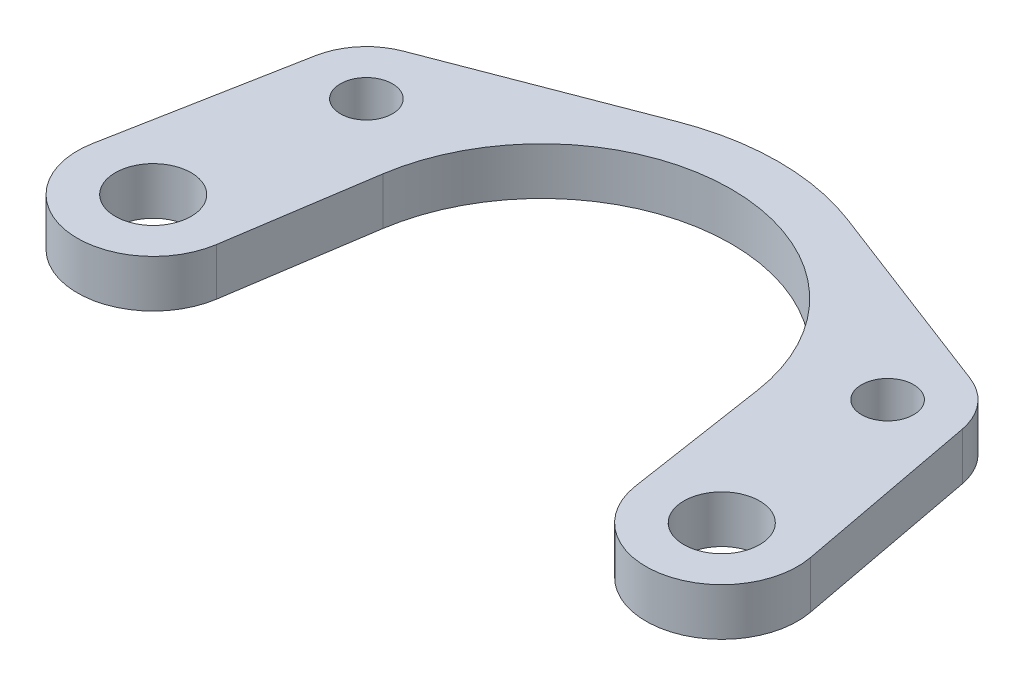
ISO-10303-21;
HEADER;
FILE_DESCRIPTION(('STEP AP214'),'2;1');
FILE_NAME('part.step','',(''),(''),'','','');
FILE_SCHEMA(('AUTOMOTIVE_DESIGN { 1 0 10303 214 1 1 1 1 }'));
ENDSEC;
DATA;
#1=APPLICATION_CONTEXT('core data for automotive mechanical design processes');
#2=APPLICATION_PROTOCOL_DEFINITION('international standard','automotive_design',2000,#1);
#3=PRODUCT_CONTEXT('',#1,'mechanical');
#4=PRODUCT('Part','Part','',(#3));
#5=PRODUCT_RELATED_PRODUCT_CATEGORY('part','',(#4));
#6=PRODUCT_DEFINITION_FORMATION('','',#4);
#7=PRODUCT_DEFINITION_CONTEXT('part definition',#1,'design');
#8=PRODUCT_DEFINITION('design','',#6,#7);
#9=PRODUCT_DEFINITION_SHAPE('','',#8);
#10=(LENGTH_UNIT() NAMED_UNIT(*) SI_UNIT(.MILLI.,.METRE.));
#11=(NAMED_UNIT(*) PLANE_ANGLE_UNIT() SI_UNIT($,.RADIAN.));
#12=(NAMED_UNIT(*) SI_UNIT($,.STERADIAN.) SOLID_ANGLE_UNIT());
#13=UNCERTAINTY_MEASURE_WITH_UNIT(LENGTH_MEASURE(1.E-05),#10,'distance_accuracy_value','');
#14=(GEOMETRIC_REPRESENTATION_CONTEXT(3) GLOBAL_UNCERTAINTY_ASSIGNED_CONTEXT((#13)) GLOBAL_UNIT_ASSIGNED_CONTEXT((#10,
#11,#12)) REPRESENTATION_CONTEXT('',''));
#15=CARTESIAN_POINT('',(0.,0.,0.));
#16=DIRECTION('',(0.,0.,1.));
#17=DIRECTION('',(1.,0.,0.));
#18=AXIS2_PLACEMENT_3D('',#15,#16,#17);
#19=CARTESIAN_POINT('',(38.1,6.35,13.97));
#20=DIRECTION('',(0.,1.,0.));
#21=DIRECTION('',(0.,0.,1.));
#22=AXIS2_PLACEMENT_3D('',#19,#20,#21);
#23=PLANE('',#22);
#24=CARTESIAN_POINT('',(-34.925,6.35,-11.43));
#25=DIRECTION('',(0.,1.,0.));
#26=DIRECTION('',(0.,0.,-1.));
#27=AXIS2_PLACEMENT_3D('',#24,#25,#26);
#28=CIRCLE('',#27,3.49250000000001);
#29=CARTESIAN_POINT('',(-34.925,6.35,-14.9225));
#30=VERTEX_POINT('',#29);
#31=EDGE_CURVE('E290',#30,#30,#28,.T.);
#32=ORIENTED_EDGE('',*,*,#31,.F.);
#33=EDGE_LOOP('',(#32));
#34=FACE_BOUND('',#33,.T.);
#35=CARTESIAN_POINT('',(38.1,6.35,13.97));
#36=DIRECTION('',(0.,1.,0.));
#37=DIRECTION('',(0.,0.,1.));
#38=AXIS2_PLACEMENT_3D('',#35,#36,#37);
#39=CIRCLE('',#38,5.08000000000001);
#40=CARTESIAN_POINT('',(38.1,6.35,19.05));
#41=VERTEX_POINT('',#40);
#42=EDGE_CURVE('E157',#41,#41,#39,.T.);
#43=ORIENTED_EDGE('',*,*,#42,.F.);
#44=EDGE_LOOP('',(#43));
#45=FACE_BOUND('',#44,.T.);
#46=CARTESIAN_POINT('',(38.1,6.35,13.97));
#47=DIRECTION('',(0.,1.,0.));
#48=DIRECTION('',(0.,0.,1.));
#49=AXIS2_PLACEMENT_3D('',#46,#47,#48);
#50=CIRCLE('',#49,10.16);
#51=CARTESIAN_POINT('',(28.0560006556144,6.35,15.5009073028699));
#52=VERTEX_POINT('',#51);
#53=CARTESIAN_POINT('',(48.0839831202843,6.35,12.0870021099644));
#54=VERTEX_POINT('',#53);
#55=EDGE_CURVE('E176',#52,#54,#50,.T.);
#56=ORIENTED_EDGE('',*,*,#55,.T.);
#57=DIRECTION('',(-0.185334437995624,0.,-0.982675503964989));
#58=VECTOR('',#57,1.);
#59=CARTESIAN_POINT('',(48.0839831202843,6.35,12.0870021099644));
#60=LINE('',#59,#58);
#61=CARTESIAN_POINT('',(43.3489857577399,6.35,-13.0187794697175));
#62=VERTEX_POINT('',#61);
#63=EDGE_CURVE('E104',#54,#62,#60,.T.);
#64=ORIENTED_EDGE('',*,*,#63,.T.);
#65=CARTESIAN_POINT('',(34.925,6.35,-11.43));
#66=DIRECTION('',(0.,1.,0.));
#67=DIRECTION('',(0.,0.,1.));
#68=AXIS2_PLACEMENT_3D('',#65,#66,#67);
#69=CIRCLE('',#68,8.5725);
#70=CARTESIAN_POINT('',(37.9944917321541,6.35,-19.4341224850847));
#71=VERTEX_POINT('',#70);
#72=EDGE_CURVE('E203',#62,#71,#69,.T.);
#73=ORIENTED_EDGE('',*,*,#72,.T.);
#74=DIRECTION('',(-0.933697577729325,0.,-0.358062610924948));
#75=VECTOR('',#74,1.);
#76=CARTESIAN_POINT('',(11.3684878968671,6.35,-29.6448980929061));
#77=LINE('',#76,#75);
#78=CARTESIAN_POINT('',(11.3684878968671,6.35,-29.6448980929061));
#79=VERTEX_POINT('',#78);
#80=EDGE_CURVE('E222',#71,#79,#77,.T.);
#81=ORIENTED_EDGE('',*,*,#80,.T.);
#82=CARTESIAN_POINT('',(0.,6.35,0.));
#83=DIRECTION('',(0.,1.,0.));
#84=DIRECTION('',(0.,0.,1.));
#85=AXIS2_PLACEMENT_3D('',#82,#83,#84);
#86=CIRCLE('',#85,31.75);
#87=CARTESIAN_POINT('',(-11.3684878968671,6.35,-29.6448980929061));
#88=VERTEX_POINT('',#87);
#89=EDGE_CURVE('E219',#79,#88,#86,.T.);
#90=ORIENTED_EDGE('',*,*,#89,.T.);
#91=DIRECTION('',(-0.933697577729325,0.,0.358062610924948));
#92=VECTOR('',#91,1.);
#93=CARTESIAN_POINT('',(-11.3684878968671,6.35,-29.6448980929061));
#94=LINE('',#93,#92);
#95=CARTESIAN_POINT('',(-37.9944917321541,6.35,-19.4341224850846));
#96=VERTEX_POINT('',#95);
#97=EDGE_CURVE('E221',#88,#96,#94,.T.);
#98=ORIENTED_EDGE('',*,*,#97,.T.);
#99=CARTESIAN_POINT('',(-34.925,6.35,-11.43));
#100=DIRECTION('',(0.,1.,0.));
#101=DIRECTION('',(0.,0.,-1.));
#102=AXIS2_PLACEMENT_3D('',#99,#100,#101);
#103=CIRCLE('',#102,8.5725);
#104=CARTESIAN_POINT('',(-43.3489857577399,6.35,-13.0187794697175));
#105=VERTEX_POINT('',#104);
#106=EDGE_CURVE('E224',#96,#105,#103,.T.);
#107=ORIENTED_EDGE('',*,*,#106,.T.);
#108=DIRECTION('',(-0.185334437995624,0.,0.98267550396499));
#109=VECTOR('',#108,1.);
#110=CARTESIAN_POINT('',(-48.0839831202843,6.35,12.0870021099645));
#111=LINE('',#110,#109);
#112=CARTESIAN_POINT('',(-48.0839831202843,6.35,12.0870021099645));
#113=VERTEX_POINT('',#112);
#114=EDGE_CURVE('E230',#105,#113,#111,.T.);
#115=ORIENTED_EDGE('',*,*,#114,.T.);
#116=CARTESIAN_POINT('',(-38.1,6.35,13.97));
#117=DIRECTION('',(0.,1.,0.));
#118=DIRECTION('',(0.,0.,-1.));
#119=AXIS2_PLACEMENT_3D('',#116,#117,#118);
#120=CIRCLE('',#119,10.16);
#121=CARTESIAN_POINT('',(-28.0560006556144,6.35,15.50090730287));
#122=VERTEX_POINT('',#121);
#123=EDGE_CURVE('E135',#113,#122,#120,.T.);
#124=ORIENTED_EDGE('',*,*,#123,.T.);
#125=DIRECTION('',(0.150679852644682,0.,-0.988582612636383));
#126=VECTOR('',#125,1.);
#127=CARTESIAN_POINT('',(-28.0560006556144,6.35,15.50090730287));
#128=LINE('',#127,#126);
#129=CARTESIAN_POINT('',(-25.1099983609641,6.35,-3.82726825717493));
#130=VERTEX_POINT('',#129);
#131=EDGE_CURVE('E129',#122,#130,#128,.T.);
#132=ORIENTED_EDGE('',*,*,#131,.T.);
#133=CARTESIAN_POINT('',(0.,6.35,0.));
#134=DIRECTION('',(0.,-1.,0.));
#135=DIRECTION('',(0.,0.,1.));
#136=AXIS2_PLACEMENT_3D('',#133,#134,#135);
#137=CIRCLE('',#136,25.4);
#138=CARTESIAN_POINT('',(25.1099983609641,6.35,-3.82726825717492));
#139=VERTEX_POINT('',#138);
#140=EDGE_CURVE('E133',#130,#139,#137,.T.);
#141=ORIENTED_EDGE('',*,*,#140,.T.);
#142=DIRECTION('',(0.150679852644682,0.,0.988582612636383));
#143=VECTOR('',#142,1.);
#144=CARTESIAN_POINT('',(28.0560006556144,6.35,15.5009073028699));
#145=LINE('',#144,#143);
#146=EDGE_CURVE('E49',#139,#52,#145,.T.);
#147=ORIENTED_EDGE('',*,*,#146,.T.);
#148=EDGE_LOOP('',(#56,#64,#73,#81,#90,#98,#107,#115,#124,#132,#141,#147));
#149=FACE_BOUND('',#148,.T.);
#150=CARTESIAN_POINT('',(34.925,6.35,-11.43));
#151=DIRECTION('',(0.,1.,0.));
#152=DIRECTION('',(0.,0.,1.));
#153=AXIS2_PLACEMENT_3D('',#150,#151,#152);
#154=CIRCLE('',#153,3.49250000000001);
#155=CARTESIAN_POINT('',(34.925,6.35,-7.9375));
#156=VERTEX_POINT('',#155);
#157=EDGE_CURVE('E296',#156,#156,#154,.T.);
#158=ORIENTED_EDGE('',*,*,#157,.F.);
#159=EDGE_LOOP('',(#158));
#160=FACE_BOUND('',#159,.T.);
#161=CARTESIAN_POINT('',(-38.1,6.35,13.97));
#162=DIRECTION('',(0.,1.,0.));
#163=DIRECTION('',(0.,0.,-1.));
#164=AXIS2_PLACEMENT_3D('',#161,#162,#163);
#165=CIRCLE('',#164,5.08000000000001);
#166=CARTESIAN_POINT('',(-38.1,6.35,8.88999999999999));
#167=VERTEX_POINT('',#166);
#168=EDGE_CURVE('E281',#167,#167,#165,.T.);
#169=ORIENTED_EDGE('',*,*,#168,.F.);
#170=EDGE_LOOP('',(#169));
#171=FACE_BOUND('',#170,.T.);
#172=ADVANCED_FACE('F32',(#34,#45,#149,#160,#171),#23,.T.);
#173=CARTESIAN_POINT('',(38.1,0.,13.97));
#174=DIRECTION('',(0.,1.,0.));
#175=DIRECTION('',(0.,0.,1.));
#176=AXIS2_PLACEMENT_3D('',#173,#174,#175);
#177=PLANE('',#176);
#178=CARTESIAN_POINT('',(38.1,0.,13.97));
#179=DIRECTION('',(0.,1.,0.));
#180=DIRECTION('',(0.,0.,1.));
#181=AXIS2_PLACEMENT_3D('',#178,#179,#180);
#182=CIRCLE('',#181,10.16);
#183=CARTESIAN_POINT('',(28.0560006556144,0.,15.5009073028699));
#184=VERTEX_POINT('',#183);
#185=CARTESIAN_POINT('',(48.0839831202843,0.,12.0870021099644));
#186=VERTEX_POINT('',#185);
#187=EDGE_CURVE('E153',#184,#186,#182,.T.);
#188=ORIENTED_EDGE('',*,*,#187,.F.);
#189=DIRECTION('',(0.150679852644682,0.,0.988582612636383));
#190=VECTOR('',#189,1.);
#191=CARTESIAN_POINT('',(28.0560006556144,0.,15.5009073028699));
#192=LINE('',#191,#190);
#193=CARTESIAN_POINT('',(25.1099983609641,0.,-3.82726825717492));
#194=VERTEX_POINT('',#193);
#195=EDGE_CURVE('E96',#194,#184,#192,.T.);
#196=ORIENTED_EDGE('',*,*,#195,.F.);
#197=CARTESIAN_POINT('',(0.,0.,0.));
#198=DIRECTION('',(0.,-1.,0.));
#199=DIRECTION('',(0.,0.,1.));
#200=AXIS2_PLACEMENT_3D('',#197,#198,#199);
#201=CIRCLE('',#200,25.4);
#202=CARTESIAN_POINT('',(-25.1099983609641,0.,-3.82726825717493));
#203=VERTEX_POINT('',#202);
#204=EDGE_CURVE('E90',#203,#194,#201,.T.);
#205=ORIENTED_EDGE('',*,*,#204,.F.);
#206=DIRECTION('',(0.150679852644682,0.,-0.988582612636383));
#207=VECTOR('',#206,1.);
#208=CARTESIAN_POINT('',(-28.0560006556144,0.,15.50090730287));
#209=LINE('',#208,#207);
#210=CARTESIAN_POINT('',(-28.0560006556144,0.,15.50090730287));
#211=VERTEX_POINT('',#210);
#212=EDGE_CURVE('E143',#211,#203,#209,.T.);
#213=ORIENTED_EDGE('',*,*,#212,.F.);
#214=CARTESIAN_POINT('',(-38.1,0.,13.97));
#215=DIRECTION('',(0.,1.,0.));
#216=DIRECTION('',(0.,0.,-1.));
#217=AXIS2_PLACEMENT_3D('',#214,#215,#216);
#218=CIRCLE('',#217,10.16);
#219=CARTESIAN_POINT('',(-48.0839831202843,0.,12.0870021099645));
#220=VERTEX_POINT('',#219);
#221=EDGE_CURVE('E171',#220,#211,#218,.T.);
#222=ORIENTED_EDGE('',*,*,#221,.F.);
#223=DIRECTION('',(-0.185334437995624,0.,0.98267550396499));
#224=VECTOR('',#223,1.);
#225=CARTESIAN_POINT('',(-48.0839831202843,0.,12.0870021099645));
#226=LINE('',#225,#224);
#227=CARTESIAN_POINT('',(-43.3489857577399,0.,-13.0187794697175));
#228=VERTEX_POINT('',#227);
#229=EDGE_CURVE('E169',#228,#220,#226,.T.);
#230=ORIENTED_EDGE('',*,*,#229,.F.);
#231=CARTESIAN_POINT('',(-34.925,0.,-11.43));
#232=DIRECTION('',(0.,1.,0.));
#233=DIRECTION('',(0.,0.,-1.));
#234=AXIS2_PLACEMENT_3D('',#231,#232,#233);
#235=CIRCLE('',#234,8.5725);
#236=CARTESIAN_POINT('',(-37.9944917321541,0.,-19.4341224850846));
#237=VERTEX_POINT('',#236);
#238=EDGE_CURVE('E167',#237,#228,#235,.T.);
#239=ORIENTED_EDGE('',*,*,#238,.F.);
#240=DIRECTION('',(-0.933697577729325,0.,0.358062610924948));
#241=VECTOR('',#240,1.);
#242=CARTESIAN_POINT('',(-11.3684878968671,0.,-29.6448980929061));
#243=LINE('',#242,#241);
#244=CARTESIAN_POINT('',(-11.3684878968671,0.,-29.6448980929061));
#245=VERTEX_POINT('',#244);
#246=EDGE_CURVE('E165',#245,#237,#243,.T.);
#247=ORIENTED_EDGE('',*,*,#246,.F.);
#248=CARTESIAN_POINT('',(0.,0.,0.));
#249=DIRECTION('',(0.,1.,0.));
#250=DIRECTION('',(0.,0.,1.));
#251=AXIS2_PLACEMENT_3D('',#248,#249,#250);
#252=CIRCLE('',#251,31.75);
#253=CARTESIAN_POINT('',(11.3684878968671,0.,-29.6448980929061));
#254=VERTEX_POINT('',#253);
#255=EDGE_CURVE('E163',#254,#245,#252,.T.);
#256=ORIENTED_EDGE('',*,*,#255,.F.);
#257=DIRECTION('',(-0.933697577729325,0.,-0.358062610924948));
#258=VECTOR('',#257,1.);
#259=CARTESIAN_POINT('',(11.3684878968671,0.,-29.6448980929061));
#260=LINE('',#259,#258);
#261=CARTESIAN_POINT('',(37.9944917321541,0.,-19.4341224850847));
#262=VERTEX_POINT('',#261);
#263=EDGE_CURVE('E161',#262,#254,#260,.T.);
#264=ORIENTED_EDGE('',*,*,#263,.F.);
#265=CARTESIAN_POINT('',(34.925,0.,-11.43));
#266=DIRECTION('',(0.,1.,0.));
#267=DIRECTION('',(0.,0.,1.));
#268=AXIS2_PLACEMENT_3D('',#265,#266,#267);
#269=CIRCLE('',#268,8.5725);
#270=CARTESIAN_POINT('',(43.3489857577399,0.,-13.0187794697175));
#271=VERTEX_POINT('',#270);
#272=EDGE_CURVE('E159',#271,#262,#269,.T.);
#273=ORIENTED_EDGE('',*,*,#272,.F.);
#274=DIRECTION('',(-0.185334437995624,0.,-0.982675503964989));
#275=VECTOR('',#274,1.);
#276=CARTESIAN_POINT('',(48.0839831202843,0.,12.0870021099644));
#277=LINE('',#276,#275);
#278=EDGE_CURVE('E156',#186,#271,#277,.T.);
#279=ORIENTED_EDGE('',*,*,#278,.F.);
#280=EDGE_LOOP('',(#188,#196,#205,#213,#222,#230,#239,#247,#256,#264,#273,#279));
#281=FACE_BOUND('',#280,.T.);
#282=CARTESIAN_POINT('',(38.1,0.,13.97));
#283=DIRECTION('',(0.,1.,0.));
#284=DIRECTION('',(0.,0.,1.));
#285=AXIS2_PLACEMENT_3D('',#282,#283,#284);
#286=CIRCLE('',#285,5.08000000000001);
#287=CARTESIAN_POINT('',(38.1,0.,19.05));
#288=VERTEX_POINT('',#287);
#289=EDGE_CURVE('E299',#288,#288,#286,.T.);
#290=ORIENTED_EDGE('',*,*,#289,.T.);
#291=EDGE_LOOP('',(#290));
#292=FACE_BOUND('',#291,.T.);
#293=CARTESIAN_POINT('',(34.925,0.,-11.43));
#294=DIRECTION('',(0.,1.,0.));
#295=DIRECTION('',(0.,0.,1.));
#296=AXIS2_PLACEMENT_3D('',#293,#294,#295);
#297=CIRCLE('',#296,3.49250000000001);
#298=CARTESIAN_POINT('',(34.925,0.,-7.9375));
#299=VERTEX_POINT('',#298);
#300=EDGE_CURVE('E293',#299,#299,#297,.T.);
#301=ORIENTED_EDGE('',*,*,#300,.T.);
#302=EDGE_LOOP('',(#301));
#303=FACE_BOUND('',#302,.T.);
#304=CARTESIAN_POINT('',(-34.925,0.,-11.43));
#305=DIRECTION('',(0.,1.,0.));
#306=DIRECTION('',(0.,0.,-1.));
#307=AXIS2_PLACEMENT_3D('',#304,#305,#306);
#308=CIRCLE('',#307,3.49250000000001);
#309=CARTESIAN_POINT('',(-34.925,0.,-14.9225));
#310=VERTEX_POINT('',#309);
#311=EDGE_CURVE('E287',#310,#310,#308,.T.);
#312=ORIENTED_EDGE('',*,*,#311,.T.);
#313=EDGE_LOOP('',(#312));
#314=FACE_BOUND('',#313,.T.);
#315=CARTESIAN_POINT('',(-38.1,0.,13.97));
#316=DIRECTION('',(0.,1.,0.));
#317=DIRECTION('',(0.,0.,-1.));
#318=AXIS2_PLACEMENT_3D('',#315,#316,#317);
#319=CIRCLE('',#318,5.08000000000001);
#320=CARTESIAN_POINT('',(-38.1,0.,8.88999999999999));
#321=VERTEX_POINT('',#320);
#322=EDGE_CURVE('E284',#321,#321,#319,.T.);
#323=ORIENTED_EDGE('',*,*,#322,.T.);
#324=EDGE_LOOP('',(#323));
#325=FACE_BOUND('',#324,.T.);
#326=ADVANCED_FACE('F207',(#281,#292,#303,#314,#325),#177,.F.);
#327=CARTESIAN_POINT('',(38.1,6.35,13.97));
#328=DIRECTION('',(0.,-1.,0.));
#329=DIRECTION('',(0.,0.,-1.));
#330=AXIS2_PLACEMENT_3D('',#327,#328,#329);
#331=CYLINDRICAL_SURFACE('',#330,10.16);
#332=ORIENTED_EDGE('',*,*,#187,.T.);
#333=DIRECTION('',(0.,-1.,0.));
#334=VECTOR('',#333,1.);
#335=CARTESIAN_POINT('',(48.0839831202843,6.35,12.0870021099644));
#336=LINE('',#335,#334);
#337=EDGE_CURVE('E11',#54,#186,#336,.T.);
#338=ORIENTED_EDGE('',*,*,#337,.F.);
#339=ORIENTED_EDGE('',*,*,#55,.F.);
#340=DIRECTION('',(0.,-1.,0.));
#341=VECTOR('',#340,1.);
#342=CARTESIAN_POINT('',(28.0560006556144,6.35,15.5009073028699));
#343=LINE('',#342,#341);
#344=EDGE_CURVE('E149',#52,#184,#343,.T.);
#345=ORIENTED_EDGE('',*,*,#344,.T.);
#346=EDGE_LOOP('',(#332,#338,#339,#345));
#347=FACE_BOUND('',#346,.T.);
#348=ADVANCED_FACE('F34',(#347),#331,.T.);
#349=CARTESIAN_POINT('',(48.0839831202843,6.35,12.0870021099644));
#350=DIRECTION('',(-0.982675503964989,0.,0.185334437995624));
#351=DIRECTION('',(0.185334437995624,0.,0.982675503964989));
#352=AXIS2_PLACEMENT_3D('',#349,#350,#351);
#353=PLANE('',#352);
#354=ORIENTED_EDGE('',*,*,#278,.T.);
#355=DIRECTION('',(0.,-1.,0.));
#356=VECTOR('',#355,1.);
#357=CARTESIAN_POINT('',(43.3489857577399,6.35,-13.0187794697175));
#358=LINE('',#357,#356);
#359=EDGE_CURVE('E41',#62,#271,#358,.T.);
#360=ORIENTED_EDGE('',*,*,#359,.F.);
#361=ORIENTED_EDGE('',*,*,#63,.F.);
#362=ORIENTED_EDGE('',*,*,#337,.T.);
#363=EDGE_LOOP('',(#354,#360,#361,#362));
#364=FACE_BOUND('',#363,.T.);
#365=ADVANCED_FACE('F409',(#364),#353,.F.);
#366=CARTESIAN_POINT('',(34.925,6.35,-11.43));
#367=DIRECTION('',(0.,-1.,0.));
#368=DIRECTION('',(0.,0.,-1.));
#369=AXIS2_PLACEMENT_3D('',#366,#367,#368);
#370=CYLINDRICAL_SURFACE('',#369,8.5725);
#371=ORIENTED_EDGE('',*,*,#272,.T.);
#372=DIRECTION('',(0.,-1.,0.));
#373=VECTOR('',#372,1.);
#374=CARTESIAN_POINT('',(37.9944917321541,6.35,-19.4341224850847));
#375=LINE('',#374,#373);
#376=EDGE_CURVE('E195',#71,#262,#375,.T.);
#377=ORIENTED_EDGE('',*,*,#376,.F.);
#378=ORIENTED_EDGE('',*,*,#72,.F.);
#379=ORIENTED_EDGE('',*,*,#359,.T.);
#380=EDGE_LOOP('',(#371,#377,#378,#379));
#381=FACE_BOUND('',#380,.T.);
#382=ADVANCED_FACE('F201',(#381),#370,.T.);
#383=CARTESIAN_POINT('',(11.3684878968671,6.35,-29.6448980929061));
#384=DIRECTION('',(-0.358062610924948,0.,0.933697577729325));
#385=DIRECTION('',(0.933697577729325,0.,0.358062610924948));
#386=AXIS2_PLACEMENT_3D('',#383,#384,#385);
#387=PLANE('',#386);
#388=ORIENTED_EDGE('',*,*,#263,.T.);
#389=DIRECTION('',(0.,-1.,0.));
#390=VECTOR('',#389,1.);
#391=CARTESIAN_POINT('',(11.3684878968671,6.35,-29.6448980929061));
#392=LINE('',#391,#390);
#393=EDGE_CURVE('E192',#79,#254,#392,.T.);
#394=ORIENTED_EDGE('',*,*,#393,.F.);
#395=ORIENTED_EDGE('',*,*,#80,.F.);
#396=ORIENTED_EDGE('',*,*,#376,.T.);
#397=EDGE_LOOP('',(#388,#394,#395,#396));
#398=FACE_BOUND('',#397,.T.);
#399=ADVANCED_FACE('F213',(#398),#387,.F.);
#400=CARTESIAN_POINT('',(0.,6.35,0.));
#401=DIRECTION('',(0.,-1.,0.));
#402=DIRECTION('',(0.,0.,-1.));
#403=AXIS2_PLACEMENT_3D('',#400,#401,#402);
#404=CYLINDRICAL_SURFACE('',#403,31.75);
#405=ORIENTED_EDGE('',*,*,#255,.T.);
#406=DIRECTION('',(0.,-1.,0.));
#407=VECTOR('',#406,1.);
#408=CARTESIAN_POINT('',(-11.3684878968671,6.35,-29.6448980929061));
#409=LINE('',#408,#407);
#410=EDGE_CURVE('E189',#88,#245,#409,.T.);
#411=ORIENTED_EDGE('',*,*,#410,.F.);
#412=ORIENTED_EDGE('',*,*,#89,.F.);
#413=ORIENTED_EDGE('',*,*,#393,.T.);
#414=EDGE_LOOP('',(#405,#411,#412,#413));
#415=FACE_BOUND('',#414,.T.);
#416=ADVANCED_FACE('F217',(#415),#404,.T.);
#417=CARTESIAN_POINT('',(-11.3684878968671,6.35,-29.6448980929061));
#418=DIRECTION('',(0.358062610924948,0.,0.933697577729325));
#419=DIRECTION('',(0.933697577729325,0.,-0.358062610924948));
#420=AXIS2_PLACEMENT_3D('',#417,#418,#419);
#421=PLANE('',#420);
#422=ORIENTED_EDGE('',*,*,#246,.T.);
#423=DIRECTION('',(0.,-1.,0.));
#424=VECTOR('',#423,1.);
#425=CARTESIAN_POINT('',(-37.9944917321541,6.35,-19.4341224850846));
#426=LINE('',#425,#424);
#427=EDGE_CURVE('E186',#96,#237,#426,.T.);
#428=ORIENTED_EDGE('',*,*,#427,.F.);
#429=ORIENTED_EDGE('',*,*,#97,.F.);
#430=ORIENTED_EDGE('',*,*,#410,.T.);
#431=EDGE_LOOP('',(#422,#428,#429,#430));
#432=FACE_BOUND('',#431,.T.);
#433=ADVANCED_FACE('F374',(#432),#421,.F.);
#434=CARTESIAN_POINT('',(-34.925,6.35,-11.43));
#435=DIRECTION('',(0.,-1.,0.));
#436=DIRECTION('',(0.,0.,-1.));
#437=AXIS2_PLACEMENT_3D('',#434,#435,#436);
#438=CYLINDRICAL_SURFACE('',#437,8.5725);
#439=ORIENTED_EDGE('',*,*,#238,.T.);
#440=DIRECTION('',(0.,-1.,0.));
#441=VECTOR('',#440,1.);
#442=CARTESIAN_POINT('',(-43.3489857577399,6.35,-13.0187794697175));
#443=LINE('',#442,#441);
#444=EDGE_CURVE('E183',#105,#228,#443,.T.);
#445=ORIENTED_EDGE('',*,*,#444,.F.);
#446=ORIENTED_EDGE('',*,*,#106,.F.);
#447=ORIENTED_EDGE('',*,*,#427,.T.);
#448=EDGE_LOOP('',(#439,#445,#446,#447));
#449=FACE_BOUND('',#448,.T.);
#450=ADVANCED_FACE('F365',(#449),#438,.T.);
#451=CARTESIAN_POINT('',(-48.0839831202843,6.35,12.0870021099645));
#452=DIRECTION('',(0.98267550396499,0.,0.185334437995624));
#453=DIRECTION('',(0.185334437995624,0.,-0.98267550396499));
#454=AXIS2_PLACEMENT_3D('',#451,#452,#453);
#455=PLANE('',#454);
#456=ORIENTED_EDGE('',*,*,#229,.T.);
#457=DIRECTION('',(0.,-1.,0.));
#458=VECTOR('',#457,1.);
#459=CARTESIAN_POINT('',(-48.0839831202843,6.35,12.0870021099645));
#460=LINE('',#459,#458);
#461=EDGE_CURVE('E180',#113,#220,#460,.T.);
#462=ORIENTED_EDGE('',*,*,#461,.F.);
#463=ORIENTED_EDGE('',*,*,#114,.F.);
#464=ORIENTED_EDGE('',*,*,#444,.T.);
#465=EDGE_LOOP('',(#456,#462,#463,#464));
#466=FACE_BOUND('',#465,.T.);
#467=ADVANCED_FACE('F236',(#466),#455,.F.);
#468=CARTESIAN_POINT('',(-38.1,6.35,13.97));
#469=DIRECTION('',(0.,-1.,0.));
#470=DIRECTION('',(0.,0.,-1.));
#471=AXIS2_PLACEMENT_3D('',#468,#469,#470);
#472=CYLINDRICAL_SURFACE('',#471,10.16);
#473=ORIENTED_EDGE('',*,*,#221,.T.);
#474=DIRECTION('',(0.,-1.,0.));
#475=VECTOR('',#474,1.);
#476=CARTESIAN_POINT('',(-28.0560006556144,6.35,15.50090730287));
#477=LINE('',#476,#475);
#478=EDGE_CURVE('E144',#122,#211,#477,.T.);
#479=ORIENTED_EDGE('',*,*,#478,.F.);
#480=ORIENTED_EDGE('',*,*,#123,.F.);
#481=ORIENTED_EDGE('',*,*,#461,.T.);
#482=EDGE_LOOP('',(#473,#479,#480,#481));
#483=FACE_BOUND('',#482,.T.);
#484=ADVANCED_FACE('F240',(#483),#472,.T.);
#485=CARTESIAN_POINT('',(-28.0560006556144,6.35,15.50090730287));
#486=DIRECTION('',(-0.988582612636383,0.,-0.150679852644682));
#487=DIRECTION('',(-0.150679852644682,0.,0.988582612636383));
#488=AXIS2_PLACEMENT_3D('',#485,#486,#487);
#489=PLANE('',#488);
#490=ORIENTED_EDGE('',*,*,#212,.T.);
#491=DIRECTION('',(0.,-1.,0.));
#492=VECTOR('',#491,1.);
#493=CARTESIAN_POINT('',(-25.1099983609641,6.35,-3.82726825717493));
#494=LINE('',#493,#492);
#495=EDGE_CURVE('E140',#130,#203,#494,.T.);
#496=ORIENTED_EDGE('',*,*,#495,.F.);
#497=ORIENTED_EDGE('',*,*,#131,.F.);
#498=ORIENTED_EDGE('',*,*,#478,.T.);
#499=EDGE_LOOP('',(#490,#496,#497,#498));
#500=FACE_BOUND('',#499,.T.);
#501=ADVANCED_FACE('F141',(#500),#489,.F.);
#502=CARTESIAN_POINT('',(0.,6.35,0.));
#503=DIRECTION('',(0.,-1.,0.));
#504=DIRECTION('',(0.,0.,-1.));
#505=AXIS2_PLACEMENT_3D('',#502,#503,#504);
#506=CYLINDRICAL_SURFACE('',#505,25.4);
#507=ORIENTED_EDGE('',*,*,#204,.T.);
#508=DIRECTION('',(0.,-1.,0.));
#509=VECTOR('',#508,1.);
#510=CARTESIAN_POINT('',(25.1099983609641,6.35,-3.82726825717492));
#511=LINE('',#510,#509);
#512=EDGE_CURVE('E145',#139,#194,#511,.T.);
#513=ORIENTED_EDGE('',*,*,#512,.F.);
#514=ORIENTED_EDGE('',*,*,#140,.F.);
#515=ORIENTED_EDGE('',*,*,#495,.T.);
#516=EDGE_LOOP('',(#507,#513,#514,#515));
#517=FACE_BOUND('',#516,.T.);
#518=ADVANCED_FACE('F147',(#517),#506,.F.);
#519=CARTESIAN_POINT('',(28.0560006556144,6.35,15.5009073028699));
#520=DIRECTION('',(0.988582612636383,0.,-0.150679852644682));
#521=DIRECTION('',(-0.150679852644682,0.,-0.988582612636383));
#522=AXIS2_PLACEMENT_3D('',#519,#520,#521);
#523=PLANE('',#522);
#524=ORIENTED_EDGE('',*,*,#195,.T.);
#525=ORIENTED_EDGE('',*,*,#344,.F.);
#526=ORIENTED_EDGE('',*,*,#146,.F.);
#527=ORIENTED_EDGE('',*,*,#512,.T.);
#528=EDGE_LOOP('',(#524,#525,#526,#527));
#529=FACE_BOUND('',#528,.T.);
#530=ADVANCED_FACE('F244',(#529),#523,.F.);
#531=CARTESIAN_POINT('',(38.1,6.35,13.97));
#532=DIRECTION('',(0.,-1.,0.));
#533=DIRECTION('',(0.,0.,-1.));
#534=AXIS2_PLACEMENT_3D('',#531,#532,#533);
#535=CYLINDRICAL_SURFACE('',#534,5.08000000000001);
#536=ORIENTED_EDGE('',*,*,#42,.T.);
#537=EDGE_LOOP('',(#536));
#538=FACE_BOUND('',#537,.T.);
#539=ORIENTED_EDGE('',*,*,#289,.F.);
#540=EDGE_LOOP('',(#539));
#541=FACE_BOUND('',#540,.T.);
#542=ADVANCED_FACE('F246',(#538,#541),#535,.F.);
#543=CARTESIAN_POINT('',(34.925,6.35,-11.43));
#544=DIRECTION('',(0.,-1.,0.));
#545=DIRECTION('',(0.,0.,-1.));
#546=AXIS2_PLACEMENT_3D('',#543,#544,#545);
#547=CYLINDRICAL_SURFACE('',#546,3.49250000000001);
#548=ORIENTED_EDGE('',*,*,#157,.T.);
#549=EDGE_LOOP('',(#548));
#550=FACE_BOUND('',#549,.T.);
#551=ORIENTED_EDGE('',*,*,#300,.F.);
#552=EDGE_LOOP('',(#551));
#553=FACE_BOUND('',#552,.T.);
#554=ADVANCED_FACE('F252',(#550,#553),#547,.F.);
#555=CARTESIAN_POINT('',(-34.925,6.35,-11.43));
#556=DIRECTION('',(0.,-1.,0.));
#557=DIRECTION('',(0.,0.,-1.));
#558=AXIS2_PLACEMENT_3D('',#555,#556,#557);
#559=CYLINDRICAL_SURFACE('',#558,3.49250000000001);
#560=ORIENTED_EDGE('',*,*,#31,.T.);
#561=EDGE_LOOP('',(#560));
#562=FACE_BOUND('',#561,.T.);
#563=ORIENTED_EDGE('',*,*,#311,.F.);
#564=EDGE_LOOP('',(#563));
#565=FACE_BOUND('',#564,.T.);
#566=ADVANCED_FACE('F268',(#562,#565),#559,.F.);
#567=CARTESIAN_POINT('',(-38.1,6.35,13.97));
#568=DIRECTION('',(0.,-1.,0.));
#569=DIRECTION('',(0.,0.,-1.));
#570=AXIS2_PLACEMENT_3D('',#567,#568,#569);
#571=CYLINDRICAL_SURFACE('',#570,5.08000000000001);
#572=ORIENTED_EDGE('',*,*,#168,.T.);
#573=EDGE_LOOP('',(#572));
#574=FACE_BOUND('',#573,.T.);
#575=ORIENTED_EDGE('',*,*,#322,.F.);
#576=EDGE_LOOP('',(#575));
#577=FACE_BOUND('',#576,.T.);
#578=ADVANCED_FACE('F272',(#574,#577),#571,.F.);
#579=CLOSED_SHELL('',(#172,#326,#348,#365,#382,#399,#416,#433,#450,#467,#484,#501,#518,#530,
#542,#554,#566,#578));
#580=MANIFOLD_SOLID_BREP('B2',#579);
#581=ADVANCED_BREP_SHAPE_REPRESENTATION('',(#18,#580),#14);
#582=SHAPE_DEFINITION_REPRESENTATION(#9,#581);
ENDSEC;
END-ISO-10303-21;
